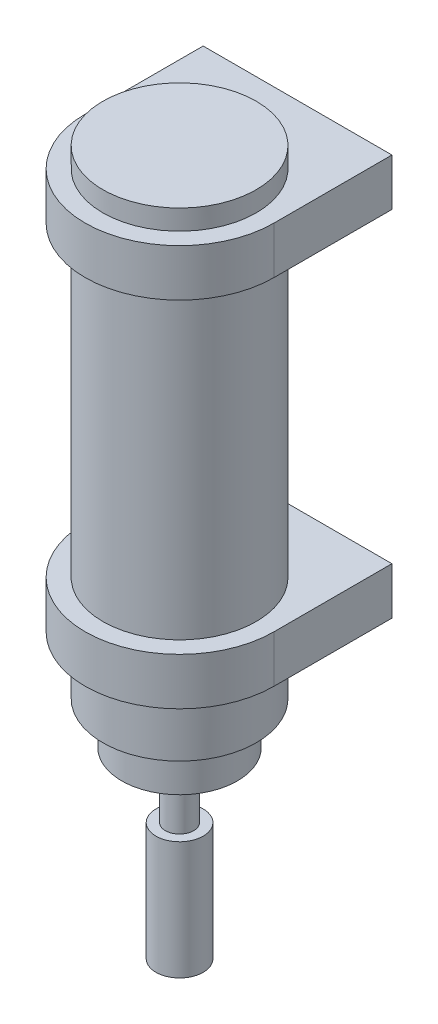
ISO-10303-21;
HEADER;
FILE_DESCRIPTION(('STEP AP214'),'2;1');
FILE_NAME('part.step','',(''),(''),'','','');
FILE_SCHEMA(('AUTOMOTIVE_DESIGN { 1 0 10303 214 1 1 1 1 }'));
ENDSEC;
DATA;
#1=APPLICATION_CONTEXT('core data for automotive mechanical design processes');
#2=APPLICATION_PROTOCOL_DEFINITION('international standard','automotive_design',2000,#1);
#3=PRODUCT_CONTEXT('',#1,'mechanical');
#4=PRODUCT('Part','Part','',(#3));
#5=PRODUCT_RELATED_PRODUCT_CATEGORY('part','',(#4));
#6=PRODUCT_DEFINITION_FORMATION('','',#4);
#7=PRODUCT_DEFINITION_CONTEXT('part definition',#1,'design');
#8=PRODUCT_DEFINITION('design','',#6,#7);
#9=PRODUCT_DEFINITION_SHAPE('','',#8);
#10=(LENGTH_UNIT() NAMED_UNIT(*) SI_UNIT(.MILLI.,.METRE.));
#11=(NAMED_UNIT(*) PLANE_ANGLE_UNIT() SI_UNIT($,.RADIAN.));
#12=(NAMED_UNIT(*) SI_UNIT($,.STERADIAN.) SOLID_ANGLE_UNIT());
#13=UNCERTAINTY_MEASURE_WITH_UNIT(LENGTH_MEASURE(1.E-05),#10,'distance_accuracy_value','');
#14=(GEOMETRIC_REPRESENTATION_CONTEXT(3) GLOBAL_UNCERTAINTY_ASSIGNED_CONTEXT((#13)) GLOBAL_UNIT_ASSIGNED_CONTEXT((#10,
#11,#12)) REPRESENTATION_CONTEXT('',''));
#15=CARTESIAN_POINT('',(0.,0.,0.));
#16=DIRECTION('',(0.,0.,1.));
#17=DIRECTION('',(1.,0.,0.));
#18=AXIS2_PLACEMENT_3D('',#15,#16,#17);
#19=CARTESIAN_POINT('',(0.,0.,0.));
#20=DIRECTION('',(0.,-1.,0.));
#21=DIRECTION('',(0.,0.,-1.));
#22=AXIS2_PLACEMENT_3D('',#19,#20,#21);
#23=CYLINDRICAL_SURFACE('',#22,32.5);
#24=CARTESIAN_POINT('',(0.,90.,0.));
#25=DIRECTION('',(0.,1.,0.));
#26=DIRECTION('',(0.,0.,1.));
#27=AXIS2_PLACEMENT_3D('',#24,#25,#26);
#28=CIRCLE('',#27,32.5);
#29=CARTESIAN_POINT('',(0.,90.,32.5));
#30=VERTEX_POINT('',#29);
#31=EDGE_CURVE('E137',#30,#30,#28,.T.);
#32=ORIENTED_EDGE('',*,*,#31,.T.);
#33=EDGE_LOOP('',(#32));
#34=FACE_BOUND('',#33,.T.);
#35=CARTESIAN_POINT('',(0.,220.,0.));
#36=DIRECTION('',(0.,1.,0.));
#37=DIRECTION('',(0.,0.,1.));
#38=AXIS2_PLACEMENT_3D('',#35,#36,#37);
#39=CIRCLE('',#38,32.5);
#40=CARTESIAN_POINT('',(0.,220.,32.5));
#41=VERTEX_POINT('',#40);
#42=EDGE_CURVE('E11',#41,#41,#39,.T.);
#43=ORIENTED_EDGE('',*,*,#42,.F.);
#44=EDGE_LOOP('',(#43));
#45=FACE_BOUND('',#44,.T.);
#46=ADVANCED_FACE('F35',(#34,#45),#23,.T.);
#47=CARTESIAN_POINT('',(0.,45.5,0.));
#48=DIRECTION('',(0.,-1.,0.));
#49=DIRECTION('',(0.,0.,-1.));
#50=AXIS2_PLACEMENT_3D('',#47,#48,#49);
#51=CIRCLE('',#50,32.5);
#52=CARTESIAN_POINT('',(0.,45.5,-32.5));
#53=VERTEX_POINT('',#52);
#54=EDGE_CURVE('E178',#53,#53,#51,.T.);
#55=ORIENTED_EDGE('',*,*,#54,.F.);
#56=EDGE_LOOP('',(#55));
#57=FACE_BOUND('',#56,.T.);
#58=CARTESIAN_POINT('',(0.,70.,0.));
#59=DIRECTION('',(0.,1.,0.));
#60=DIRECTION('',(0.,0.,1.));
#61=AXIS2_PLACEMENT_3D('',#58,#59,#60);
#62=CIRCLE('',#61,32.5);
#63=CARTESIAN_POINT('',(0.,70.,32.5));
#64=VERTEX_POINT('',#63);
#65=EDGE_CURVE('E44',#64,#64,#62,.T.);
#66=ORIENTED_EDGE('',*,*,#65,.F.);
#67=EDGE_LOOP('',(#66));
#68=FACE_BOUND('',#67,.T.);
#69=ADVANCED_FACE('F188',(#57,#68),#23,.T.);
#70=CARTESIAN_POINT('',(-32.5,45.5,0.));
#71=DIRECTION('',(0.,1.,0.));
#72=DIRECTION('',(0.,0.,1.));
#73=AXIS2_PLACEMENT_3D('',#70,#71,#72);
#74=PLANE('',#73);
#75=CARTESIAN_POINT('',(0.,45.5,0.));
#76=DIRECTION('',(0.,-1.,0.));
#77=DIRECTION('',(0.,0.,-1.));
#78=AXIS2_PLACEMENT_3D('',#75,#76,#77);
#79=CIRCLE('',#78,24.5);
#80=CARTESIAN_POINT('',(0.,45.5,-24.5));
#81=VERTEX_POINT('',#80);
#82=EDGE_CURVE('E175',#81,#81,#79,.T.);
#83=ORIENTED_EDGE('',*,*,#82,.F.);
#84=EDGE_LOOP('',(#83));
#85=FACE_BOUND('',#84,.T.);
#86=ORIENTED_EDGE('',*,*,#54,.T.);
#87=EDGE_LOOP('',(#86));
#88=FACE_BOUND('',#87,.T.);
#89=ADVANCED_FACE('F190',(#85,#88),#74,.F.);
#90=CARTESIAN_POINT('',(0.,0.,0.));
#91=DIRECTION('',(0.,-1.,0.));
#92=DIRECTION('',(0.,0.,-1.));
#93=AXIS2_PLACEMENT_3D('',#90,#91,#92);
#94=CYLINDRICAL_SURFACE('',#93,24.5);
#95=CARTESIAN_POINT('',(0.,27.5,0.));
#96=DIRECTION('',(0.,-1.,0.));
#97=DIRECTION('',(0.,0.,-1.));
#98=AXIS2_PLACEMENT_3D('',#95,#96,#97);
#99=CIRCLE('',#98,24.5);
#100=CARTESIAN_POINT('',(0.,27.5,-24.5));
#101=VERTEX_POINT('',#100);
#102=EDGE_CURVE('E172',#101,#101,#99,.T.);
#103=ORIENTED_EDGE('',*,*,#102,.F.);
#104=EDGE_LOOP('',(#103));
#105=FACE_BOUND('',#104,.T.);
#106=ORIENTED_EDGE('',*,*,#82,.T.);
#107=EDGE_LOOP('',(#106));
#108=FACE_BOUND('',#107,.T.);
#109=ADVANCED_FACE('F197',(#105,#108),#94,.T.);
#110=CARTESIAN_POINT('',(-24.5,27.5,0.));
#111=DIRECTION('',(0.,1.,0.));
#112=DIRECTION('',(0.,0.,1.));
#113=AXIS2_PLACEMENT_3D('',#110,#111,#112);
#114=PLANE('',#113);
#115=CARTESIAN_POINT('',(0.,27.5,0.));
#116=DIRECTION('',(0.,-1.,0.));
#117=DIRECTION('',(0.,0.,-1.));
#118=AXIS2_PLACEMENT_3D('',#115,#116,#117);
#119=CIRCLE('',#118,5.99999999999999);
#120=CARTESIAN_POINT('',(0.,27.5,-5.99999999999999));
#121=VERTEX_POINT('',#120);
#122=EDGE_CURVE('E169',#121,#121,#119,.T.);
#123=ORIENTED_EDGE('',*,*,#122,.F.);
#124=EDGE_LOOP('',(#123));
#125=FACE_BOUND('',#124,.T.);
#126=ORIENTED_EDGE('',*,*,#102,.T.);
#127=EDGE_LOOP('',(#126));
#128=FACE_BOUND('',#127,.T.);
#129=ADVANCED_FACE('F279',(#125,#128),#114,.F.);
#130=CARTESIAN_POINT('',(0.,0.,0.));
#131=DIRECTION('',(0.,-1.,0.));
#132=DIRECTION('',(0.,0.,-1.));
#133=AXIS2_PLACEMENT_3D('',#130,#131,#132);
#134=CYLINDRICAL_SURFACE('',#133,6.);
#135=CARTESIAN_POINT('',(0.,0.,0.));
#136=DIRECTION('',(0.,-1.,0.));
#137=DIRECTION('',(0.,0.,-1.));
#138=AXIS2_PLACEMENT_3D('',#135,#136,#137);
#139=CIRCLE('',#138,6.);
#140=CARTESIAN_POINT('',(0.,0.,-6.));
#141=VERTEX_POINT('',#140);
#142=EDGE_CURVE('E166',#141,#141,#139,.T.);
#143=ORIENTED_EDGE('',*,*,#142,.F.);
#144=EDGE_LOOP('',(#143));
#145=FACE_BOUND('',#144,.T.);
#146=ORIENTED_EDGE('',*,*,#122,.T.);
#147=EDGE_LOOP('',(#146));
#148=FACE_BOUND('',#147,.T.);
#149=ADVANCED_FACE('F260',(#145,#148),#134,.T.);
#150=CARTESIAN_POINT('',(0.,90.,0.));
#151=DIRECTION('',(0.,1.,0.));
#152=DIRECTION('',(0.,0.,1.));
#153=AXIS2_PLACEMENT_3D('',#150,#151,#152);
#154=PLANE('',#153);
#155=CARTESIAN_POINT('',(0.,90.,0.));
#156=DIRECTION('',(0.,1.,0.));
#157=DIRECTION('',(0.,0.,1.));
#158=AXIS2_PLACEMENT_3D('',#155,#156,#157);
#159=CIRCLE('',#158,40.);
#160=CARTESIAN_POINT('',(-40.,90.,0.));
#161=VERTEX_POINT('',#160);
#162=CARTESIAN_POINT('',(40.,90.,0.));
#163=VERTEX_POINT('',#162);
#164=EDGE_CURVE('E146',#161,#163,#159,.T.);
#165=ORIENTED_EDGE('',*,*,#164,.T.);
#166=DIRECTION('',(0.,0.,-1.));
#167=VECTOR('',#166,1.);
#168=CARTESIAN_POINT('',(40.,90.,-50.));
#169=LINE('',#168,#167);
#170=CARTESIAN_POINT('',(40.,90.,-50.));
#171=VERTEX_POINT('',#170);
#172=EDGE_CURVE('E84',#163,#171,#169,.T.);
#173=ORIENTED_EDGE('',*,*,#172,.T.);
#174=DIRECTION('',(-1.,0.,0.));
#175=VECTOR('',#174,1.);
#176=CARTESIAN_POINT('',(-40.,90.,-50.));
#177=LINE('',#176,#175);
#178=CARTESIAN_POINT('',(-40.,90.,-50.));
#179=VERTEX_POINT('',#178);
#180=EDGE_CURVE('E149',#171,#179,#177,.T.);
#181=ORIENTED_EDGE('',*,*,#180,.T.);
#182=DIRECTION('',(0.,0.,1.));
#183=VECTOR('',#182,1.);
#184=CARTESIAN_POINT('',(-40.,90.,0.));
#185=LINE('',#184,#183);
#186=EDGE_CURVE('E52',#179,#161,#185,.T.);
#187=ORIENTED_EDGE('',*,*,#186,.T.);
#188=EDGE_LOOP('',(#165,#173,#181,#187));
#189=FACE_BOUND('',#188,.T.);
#190=ORIENTED_EDGE('',*,*,#31,.F.);
#191=EDGE_LOOP('',(#190));
#192=FACE_BOUND('',#191,.T.);
#193=ADVANCED_FACE('F257',(#189,#192),#154,.T.);
#194=CARTESIAN_POINT('',(0.,70.,0.));
#195=DIRECTION('',(0.,1.,0.));
#196=DIRECTION('',(0.,0.,1.));
#197=AXIS2_PLACEMENT_3D('',#194,#195,#196);
#198=PLANE('',#197);
#199=CARTESIAN_POINT('',(0.,70.,0.));
#200=DIRECTION('',(0.,1.,0.));
#201=DIRECTION('',(0.,0.,1.));
#202=AXIS2_PLACEMENT_3D('',#199,#200,#201);
#203=CIRCLE('',#202,40.);
#204=CARTESIAN_POINT('',(-40.,70.,0.));
#205=VERTEX_POINT('',#204);
#206=CARTESIAN_POINT('',(40.,70.,0.));
#207=VERTEX_POINT('',#206);
#208=EDGE_CURVE('E140',#205,#207,#203,.T.);
#209=ORIENTED_EDGE('',*,*,#208,.F.);
#210=DIRECTION('',(0.,0.,1.));
#211=VECTOR('',#210,1.);
#212=CARTESIAN_POINT('',(-40.,70.,0.));
#213=LINE('',#212,#211);
#214=CARTESIAN_POINT('',(-40.,70.,-50.));
#215=VERTEX_POINT('',#214);
#216=EDGE_CURVE('E76',#215,#205,#213,.T.);
#217=ORIENTED_EDGE('',*,*,#216,.F.);
#218=DIRECTION('',(-1.,0.,0.));
#219=VECTOR('',#218,1.);
#220=CARTESIAN_POINT('',(-40.,70.,-50.));
#221=LINE('',#220,#219);
#222=CARTESIAN_POINT('',(40.,70.,-50.));
#223=VERTEX_POINT('',#222);
#224=EDGE_CURVE('E70',#223,#215,#221,.T.);
#225=ORIENTED_EDGE('',*,*,#224,.F.);
#226=DIRECTION('',(0.,0.,-1.));
#227=VECTOR('',#226,1.);
#228=CARTESIAN_POINT('',(40.,70.,-50.));
#229=LINE('',#228,#227);
#230=EDGE_CURVE('E155',#207,#223,#229,.T.);
#231=ORIENTED_EDGE('',*,*,#230,.F.);
#232=EDGE_LOOP('',(#209,#217,#225,#231));
#233=FACE_BOUND('',#232,.T.);
#234=ORIENTED_EDGE('',*,*,#65,.T.);
#235=EDGE_LOOP('',(#234));
#236=FACE_BOUND('',#235,.T.);
#237=ADVANCED_FACE('F186',(#233,#236),#198,.F.);
#238=CARTESIAN_POINT('',(0.,90.,0.));
#239=DIRECTION('',(0.,-1.,0.));
#240=DIRECTION('',(0.,0.,-1.));
#241=AXIS2_PLACEMENT_3D('',#238,#239,#240);
#242=CYLINDRICAL_SURFACE('',#241,40.);
#243=ORIENTED_EDGE('',*,*,#208,.T.);
#244=DIRECTION('',(0.,-1.,0.));
#245=VECTOR('',#244,1.);
#246=CARTESIAN_POINT('',(40.,90.,0.));
#247=LINE('',#246,#245);
#248=EDGE_CURVE('E164',#163,#207,#247,.T.);
#249=ORIENTED_EDGE('',*,*,#248,.F.);
#250=ORIENTED_EDGE('',*,*,#164,.F.);
#251=DIRECTION('',(0.,-1.,0.));
#252=VECTOR('',#251,1.);
#253=CARTESIAN_POINT('',(-40.,90.,0.));
#254=LINE('',#253,#252);
#255=EDGE_CURVE('E152',#161,#205,#254,.T.);
#256=ORIENTED_EDGE('',*,*,#255,.T.);
#257=EDGE_LOOP('',(#243,#249,#250,#256));
#258=FACE_BOUND('',#257,.T.);
#259=ADVANCED_FACE('F263',(#258),#242,.T.);
#260=CARTESIAN_POINT('',(40.,90.,-50.));
#261=DIRECTION('',(-1.,0.,0.));
#262=DIRECTION('',(0.,0.,1.));
#263=AXIS2_PLACEMENT_3D('',#260,#261,#262);
#264=PLANE('',#263);
#265=ORIENTED_EDGE('',*,*,#230,.T.);
#266=DIRECTION('',(0.,-1.,0.));
#267=VECTOR('',#266,1.);
#268=CARTESIAN_POINT('',(40.,90.,-50.));
#269=LINE('',#268,#267);
#270=EDGE_CURVE('E162',#171,#223,#269,.T.);
#271=ORIENTED_EDGE('',*,*,#270,.F.);
#272=ORIENTED_EDGE('',*,*,#172,.F.);
#273=ORIENTED_EDGE('',*,*,#248,.T.);
#274=EDGE_LOOP('',(#265,#271,#272,#273));
#275=FACE_BOUND('',#274,.T.);
#276=ADVANCED_FACE('F271',(#275),#264,.F.);
#277=CARTESIAN_POINT('',(-40.,90.,-50.));
#278=DIRECTION('',(0.,0.,1.));
#279=DIRECTION('',(1.,0.,0.));
#280=AXIS2_PLACEMENT_3D('',#277,#278,#279);
#281=PLANE('',#280);
#282=ORIENTED_EDGE('',*,*,#224,.T.);
#283=DIRECTION('',(0.,-1.,0.));
#284=VECTOR('',#283,1.);
#285=CARTESIAN_POINT('',(-40.,90.,-50.));
#286=LINE('',#285,#284);
#287=EDGE_CURVE('E160',#179,#215,#286,.T.);
#288=ORIENTED_EDGE('',*,*,#287,.F.);
#289=ORIENTED_EDGE('',*,*,#180,.F.);
#290=ORIENTED_EDGE('',*,*,#270,.T.);
#291=EDGE_LOOP('',(#282,#288,#289,#290));
#292=FACE_BOUND('',#291,.T.);
#293=ADVANCED_FACE('F268',(#292),#281,.F.);
#294=CARTESIAN_POINT('',(-40.,90.,0.));
#295=DIRECTION('',(1.,0.,0.));
#296=DIRECTION('',(0.,0.,-1.));
#297=AXIS2_PLACEMENT_3D('',#294,#295,#296);
#298=PLANE('',#297);
#299=ORIENTED_EDGE('',*,*,#216,.T.);
#300=ORIENTED_EDGE('',*,*,#255,.F.);
#301=ORIENTED_EDGE('',*,*,#186,.F.);
#302=ORIENTED_EDGE('',*,*,#287,.T.);
#303=EDGE_LOOP('',(#299,#300,#301,#302));
#304=FACE_BOUND('',#303,.T.);
#305=ADVANCED_FACE('F265',(#304),#298,.F.);
#306=CARTESIAN_POINT('',(0.,240.,0.));
#307=DIRECTION('',(0.,1.,0.));
#308=DIRECTION('',(0.,0.,1.));
#309=AXIS2_PLACEMENT_3D('',#306,#307,#308);
#310=PLANE('',#309);
#311=CARTESIAN_POINT('',(0.,240.,0.));
#312=DIRECTION('',(0.,1.,0.));
#313=DIRECTION('',(0.,0.,1.));
#314=AXIS2_PLACEMENT_3D('',#311,#312,#313);
#315=CIRCLE('',#314,40.);
#316=CARTESIAN_POINT('',(-40.,240.,0.));
#317=VERTEX_POINT('',#316);
#318=CARTESIAN_POINT('',(40.,240.,0.));
#319=VERTEX_POINT('',#318);
#320=EDGE_CURVE('E122',#317,#319,#315,.T.);
#321=ORIENTED_EDGE('',*,*,#320,.T.);
#322=DIRECTION('',(0.,0.,-1.));
#323=VECTOR('',#322,1.);
#324=CARTESIAN_POINT('',(40.,240.,-50.));
#325=LINE('',#324,#323);
#326=CARTESIAN_POINT('',(40.,240.,-50.));
#327=VERTEX_POINT('',#326);
#328=EDGE_CURVE('E111',#319,#327,#325,.T.);
#329=ORIENTED_EDGE('',*,*,#328,.T.);
#330=DIRECTION('',(-1.,0.,0.));
#331=VECTOR('',#330,1.);
#332=CARTESIAN_POINT('',(-40.,240.,-50.));
#333=LINE('',#332,#331);
#334=CARTESIAN_POINT('',(-40.,240.,-50.));
#335=VERTEX_POINT('',#334);
#336=EDGE_CURVE('E121',#327,#335,#333,.T.);
#337=ORIENTED_EDGE('',*,*,#336,.T.);
#338=DIRECTION('',(0.,0.,1.));
#339=VECTOR('',#338,1.);
#340=CARTESIAN_POINT('',(-40.,240.,0.));
#341=LINE('',#340,#339);
#342=EDGE_CURVE('E128',#335,#317,#341,.T.);
#343=ORIENTED_EDGE('',*,*,#342,.T.);
#344=EDGE_LOOP('',(#321,#329,#337,#343));
#345=FACE_BOUND('',#344,.T.);
#346=CARTESIAN_POINT('',(0.,240.,0.));
#347=DIRECTION('',(0.,1.,0.));
#348=DIRECTION('',(0.,0.,1.));
#349=AXIS2_PLACEMENT_3D('',#346,#347,#348);
#350=CIRCLE('',#349,32.5);
#351=CARTESIAN_POINT('',(0.,240.,32.5));
#352=VERTEX_POINT('',#351);
#353=EDGE_CURVE('E217',#352,#352,#350,.T.);
#354=ORIENTED_EDGE('',*,*,#353,.F.);
#355=EDGE_LOOP('',(#354));
#356=FACE_BOUND('',#355,.T.);
#357=ADVANCED_FACE('F125',(#345,#356),#310,.T.);
#358=CARTESIAN_POINT('',(0.,220.,0.));
#359=DIRECTION('',(0.,1.,0.));
#360=DIRECTION('',(0.,0.,1.));
#361=AXIS2_PLACEMENT_3D('',#358,#359,#360);
#362=PLANE('',#361);
#363=CARTESIAN_POINT('',(0.,220.,0.));
#364=DIRECTION('',(0.,1.,0.));
#365=DIRECTION('',(0.,0.,1.));
#366=AXIS2_PLACEMENT_3D('',#363,#364,#365);
#367=CIRCLE('',#366,40.);
#368=CARTESIAN_POINT('',(-40.,220.,0.));
#369=VERTEX_POINT('',#368);
#370=CARTESIAN_POINT('',(40.,220.,0.));
#371=VERTEX_POINT('',#370);
#372=EDGE_CURVE('E136',#369,#371,#367,.T.);
#373=ORIENTED_EDGE('',*,*,#372,.F.);
#374=DIRECTION('',(0.,0.,1.));
#375=VECTOR('',#374,1.);
#376=CARTESIAN_POINT('',(-40.,220.,0.));
#377=LINE('',#376,#375);
#378=CARTESIAN_POINT('',(-40.,220.,-50.));
#379=VERTEX_POINT('',#378);
#380=EDGE_CURVE('E132',#379,#369,#377,.T.);
#381=ORIENTED_EDGE('',*,*,#380,.F.);
#382=DIRECTION('',(-1.,0.,0.));
#383=VECTOR('',#382,1.);
#384=CARTESIAN_POINT('',(-40.,220.,-50.));
#385=LINE('',#384,#383);
#386=CARTESIAN_POINT('',(40.,220.,-50.));
#387=VERTEX_POINT('',#386);
#388=EDGE_CURVE('E232',#387,#379,#385,.T.);
#389=ORIENTED_EDGE('',*,*,#388,.F.);
#390=DIRECTION('',(0.,0.,-1.));
#391=VECTOR('',#390,1.);
#392=CARTESIAN_POINT('',(40.,220.,-50.));
#393=LINE('',#392,#391);
#394=EDGE_CURVE('E221',#371,#387,#393,.T.);
#395=ORIENTED_EDGE('',*,*,#394,.F.);
#396=EDGE_LOOP('',(#373,#381,#389,#395));
#397=FACE_BOUND('',#396,.T.);
#398=ORIENTED_EDGE('',*,*,#42,.T.);
#399=EDGE_LOOP('',(#398));
#400=FACE_BOUND('',#399,.T.);
#401=ADVANCED_FACE('F242',(#397,#400),#362,.F.);
#402=CARTESIAN_POINT('',(0.,240.,0.));
#403=DIRECTION('',(0.,-1.,0.));
#404=DIRECTION('',(0.,0.,-1.));
#405=AXIS2_PLACEMENT_3D('',#402,#403,#404);
#406=CYLINDRICAL_SURFACE('',#405,40.);
#407=ORIENTED_EDGE('',*,*,#372,.T.);
#408=DIRECTION('',(0.,-1.,0.));
#409=VECTOR('',#408,1.);
#410=CARTESIAN_POINT('',(40.,240.,0.));
#411=LINE('',#410,#409);
#412=EDGE_CURVE('E115',#319,#371,#411,.T.);
#413=ORIENTED_EDGE('',*,*,#412,.F.);
#414=ORIENTED_EDGE('',*,*,#320,.F.);
#415=DIRECTION('',(0.,-1.,0.));
#416=VECTOR('',#415,1.);
#417=CARTESIAN_POINT('',(-40.,240.,0.));
#418=LINE('',#417,#416);
#419=EDGE_CURVE('E229',#317,#369,#418,.T.);
#420=ORIENTED_EDGE('',*,*,#419,.T.);
#421=EDGE_LOOP('',(#407,#413,#414,#420));
#422=FACE_BOUND('',#421,.T.);
#423=ADVANCED_FACE('F134',(#422),#406,.T.);
#424=CARTESIAN_POINT('',(40.,240.,-50.));
#425=DIRECTION('',(-1.,0.,0.));
#426=DIRECTION('',(0.,0.,1.));
#427=AXIS2_PLACEMENT_3D('',#424,#425,#426);
#428=PLANE('',#427);
#429=ORIENTED_EDGE('',*,*,#394,.T.);
#430=DIRECTION('',(0.,-1.,0.));
#431=VECTOR('',#430,1.);
#432=CARTESIAN_POINT('',(40.,240.,-50.));
#433=LINE('',#432,#431);
#434=EDGE_CURVE('E118',#327,#387,#433,.T.);
#435=ORIENTED_EDGE('',*,*,#434,.F.);
#436=ORIENTED_EDGE('',*,*,#328,.F.);
#437=ORIENTED_EDGE('',*,*,#412,.T.);
#438=EDGE_LOOP('',(#429,#435,#436,#437));
#439=FACE_BOUND('',#438,.T.);
#440=ADVANCED_FACE('F113',(#439),#428,.F.);
#441=CARTESIAN_POINT('',(-40.,240.,-50.));
#442=DIRECTION('',(0.,0.,1.));
#443=DIRECTION('',(1.,0.,0.));
#444=AXIS2_PLACEMENT_3D('',#441,#442,#443);
#445=PLANE('',#444);
#446=ORIENTED_EDGE('',*,*,#388,.T.);
#447=DIRECTION('',(0.,-1.,0.));
#448=VECTOR('',#447,1.);
#449=CARTESIAN_POINT('',(-40.,240.,-50.));
#450=LINE('',#449,#448);
#451=EDGE_CURVE('E142',#335,#379,#450,.T.);
#452=ORIENTED_EDGE('',*,*,#451,.F.);
#453=ORIENTED_EDGE('',*,*,#336,.F.);
#454=ORIENTED_EDGE('',*,*,#434,.T.);
#455=EDGE_LOOP('',(#446,#452,#453,#454));
#456=FACE_BOUND('',#455,.T.);
#457=ADVANCED_FACE('F244',(#456),#445,.F.);
#458=CARTESIAN_POINT('',(-40.,240.,0.));
#459=DIRECTION('',(1.,0.,0.));
#460=DIRECTION('',(0.,0.,-1.));
#461=AXIS2_PLACEMENT_3D('',#458,#459,#460);
#462=PLANE('',#461);
#463=ORIENTED_EDGE('',*,*,#380,.T.);
#464=ORIENTED_EDGE('',*,*,#419,.F.);
#465=ORIENTED_EDGE('',*,*,#342,.F.);
#466=ORIENTED_EDGE('',*,*,#451,.T.);
#467=EDGE_LOOP('',(#463,#464,#465,#466));
#468=FACE_BOUND('',#467,.T.);
#469=ADVANCED_FACE('F212',(#468),#462,.F.);
#470=CARTESIAN_POINT('',(0.,248.5,0.));
#471=DIRECTION('',(0.,-1.,0.));
#472=DIRECTION('',(0.,0.,-1.));
#473=AXIS2_PLACEMENT_3D('',#470,#471,#472);
#474=PLANE('',#473);
#475=CARTESIAN_POINT('',(0.,248.5,0.));
#476=DIRECTION('',(0.,-1.,0.));
#477=DIRECTION('',(0.,0.,-1.));
#478=AXIS2_PLACEMENT_3D('',#475,#476,#477);
#479=CIRCLE('',#478,32.5);
#480=CARTESIAN_POINT('',(0.,248.5,-32.5));
#481=VERTEX_POINT('',#480);
#482=EDGE_CURVE('E181',#481,#481,#479,.T.);
#483=ORIENTED_EDGE('',*,*,#482,.F.);
#484=EDGE_LOOP('',(#483));
#485=FACE_BOUND('',#484,.T.);
#486=ADVANCED_FACE('F37',(#485),#474,.F.);
#487=ORIENTED_EDGE('',*,*,#353,.T.);
#488=EDGE_LOOP('',(#487));
#489=FACE_BOUND('',#488,.T.);
#490=ORIENTED_EDGE('',*,*,#482,.T.);
#491=EDGE_LOOP('',(#490));
#492=FACE_BOUND('',#491,.T.);
#493=ADVANCED_FACE('F192',(#489,#492),#23,.T.);
#494=CARTESIAN_POINT('',(0.,-50.,0.));
#495=DIRECTION('',(0.,1.,0.));
#496=DIRECTION('',(-1.,0.,0.));
#497=AXIS2_PLACEMENT_3D('',#494,#495,#496);
#498=CYLINDRICAL_SURFACE('',#497,10.);
#499=CARTESIAN_POINT('',(0.,-50.,0.));
#500=DIRECTION('',(0.,-1.,0.));
#501=DIRECTION('',(1.,0.,0.));
#502=AXIS2_PLACEMENT_3D('',#499,#500,#501);
#503=CIRCLE('',#502,10.);
#504=CARTESIAN_POINT('',(10.,-50.,0.));
#505=VERTEX_POINT('',#504);
#506=EDGE_CURVE('E219',#505,#505,#503,.T.);
#507=ORIENTED_EDGE('',*,*,#506,.F.);
#508=EDGE_LOOP('',(#507));
#509=FACE_BOUND('',#508,.T.);
#510=CARTESIAN_POINT('',(0.,0.,0.));
#511=DIRECTION('',(0.,-1.,0.));
#512=DIRECTION('',(1.,0.,0.));
#513=AXIS2_PLACEMENT_3D('',#510,#511,#512);
#514=CIRCLE('',#513,10.);
#515=CARTESIAN_POINT('',(10.,0.,0.));
#516=VERTEX_POINT('',#515);
#517=EDGE_CURVE('E224',#516,#516,#514,.T.);
#518=ORIENTED_EDGE('',*,*,#517,.T.);
#519=EDGE_LOOP('',(#518));
#520=FACE_BOUND('',#519,.T.);
#521=ADVANCED_FACE('F203',(#509,#520),#498,.T.);
#522=CARTESIAN_POINT('',(0.,-50.,0.));
#523=DIRECTION('',(0.,-1.,0.));
#524=DIRECTION('',(1.,0.,0.));
#525=AXIS2_PLACEMENT_3D('',#522,#523,#524);
#526=PLANE('',#525);
#527=ORIENTED_EDGE('',*,*,#506,.T.);
#528=EDGE_LOOP('',(#527));
#529=FACE_BOUND('',#528,.T.);
#530=ADVANCED_FACE('F209',(#529),#526,.T.);
#531=CARTESIAN_POINT('',(0.,0.,0.));
#532=DIRECTION('',(0.,-1.,0.));
#533=DIRECTION('',(1.,0.,0.));
#534=AXIS2_PLACEMENT_3D('',#531,#532,#533);
#535=PLANE('',#534);
#536=ORIENTED_EDGE('',*,*,#142,.T.);
#537=EDGE_LOOP('',(#536));
#538=FACE_BOUND('',#537,.T.);
#539=ORIENTED_EDGE('',*,*,#517,.F.);
#540=EDGE_LOOP('',(#539));
#541=FACE_BOUND('',#540,.T.);
#542=ADVANCED_FACE('F378',(#538,#541),#535,.F.);
#543=CLOSED_SHELL('',(#46,#69,#89,#109,#129,#149,#193,#237,#259,#276,#293,#305,#357,#401,#423,
#440,#457,#469,#486,#493,#521,#530,#542));
#544=MANIFOLD_SOLID_BREP('B2',#543);
#545=ADVANCED_BREP_SHAPE_REPRESENTATION('',(#18,#544),#14);
#546=SHAPE_DEFINITION_REPRESENTATION(#9,#545);
ENDSEC;
END-ISO-10303-21;
